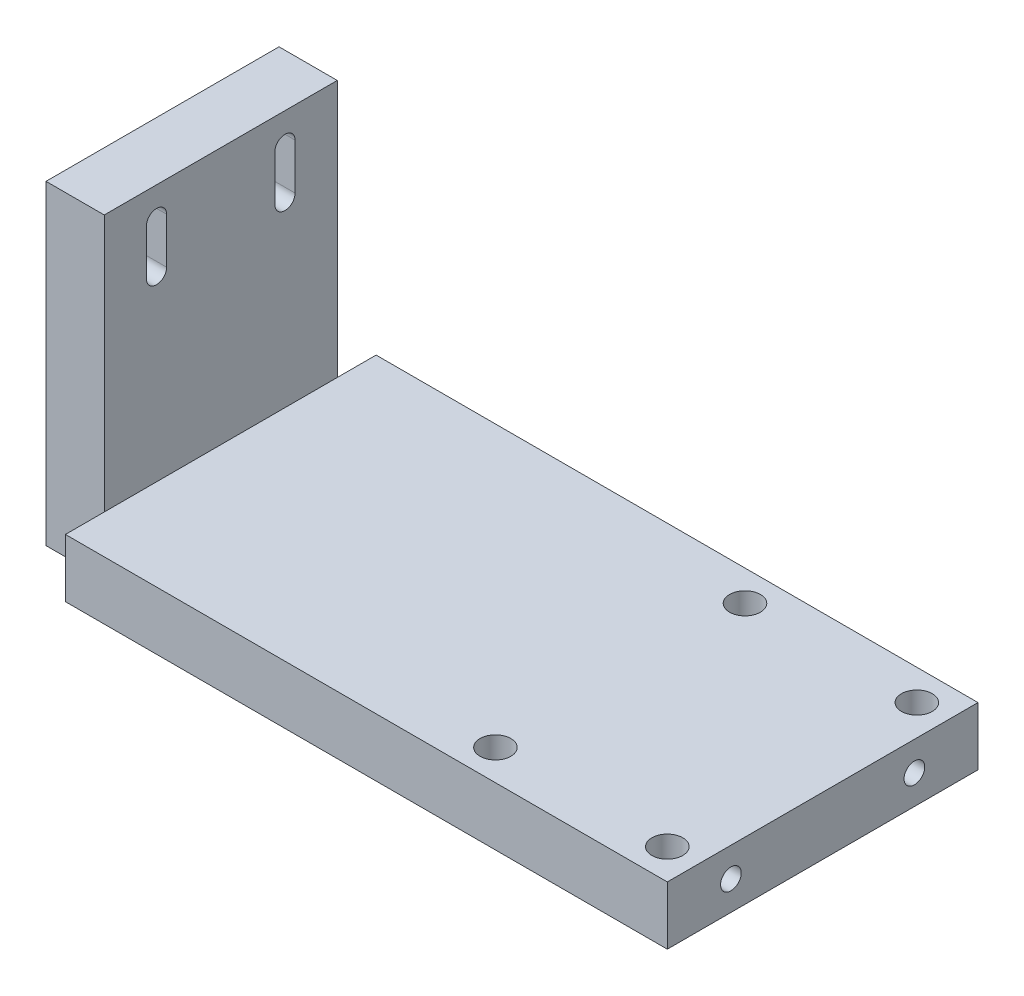
ISO-10303-21;
HEADER;
FILE_DESCRIPTION(('STEP AP214'),'2;1');
FILE_NAME('part.step','',(''),(''),'','','');
FILE_SCHEMA(('AUTOMOTIVE_DESIGN { 1 0 10303 214 1 1 1 1 }'));
ENDSEC;
DATA;
#1=APPLICATION_CONTEXT('core data for automotive mechanical design processes');
#2=APPLICATION_PROTOCOL_DEFINITION('international standard','automotive_design',2000,#1);
#3=PRODUCT_CONTEXT('',#1,'mechanical');
#4=PRODUCT('Part','Part','',(#3));
#5=PRODUCT_RELATED_PRODUCT_CATEGORY('part','',(#4));
#6=PRODUCT_DEFINITION_FORMATION('','',#4);
#7=PRODUCT_DEFINITION_CONTEXT('part definition',#1,'design');
#8=PRODUCT_DEFINITION('design','',#6,#7);
#9=PRODUCT_DEFINITION_SHAPE('','',#8);
#10=(LENGTH_UNIT() NAMED_UNIT(*) SI_UNIT(.MILLI.,.METRE.));
#11=(NAMED_UNIT(*) PLANE_ANGLE_UNIT() SI_UNIT($,.RADIAN.));
#12=(NAMED_UNIT(*) SI_UNIT($,.STERADIAN.) SOLID_ANGLE_UNIT());
#13=UNCERTAINTY_MEASURE_WITH_UNIT(LENGTH_MEASURE(1.E-05),#10,'distance_accuracy_value','');
#14=(GEOMETRIC_REPRESENTATION_CONTEXT(3) GLOBAL_UNCERTAINTY_ASSIGNED_CONTEXT((#13)) GLOBAL_UNIT_ASSIGNED_CONTEXT((#10,
#11,#12)) REPRESENTATION_CONTEXT('',''));
#15=CARTESIAN_POINT('',(0.,0.,0.));
#16=DIRECTION('',(0.,0.,1.));
#17=DIRECTION('',(1.,0.,0.));
#18=AXIS2_PLACEMENT_3D('',#15,#16,#17);
#19=CARTESIAN_POINT('',(9.52499999999982,0.,50.8));
#20=DIRECTION('',(-1.,0.,0.));
#21=DIRECTION('',(0.,0.,1.));
#22=AXIS2_PLACEMENT_3D('',#19,#20,#21);
#23=PLANE('',#22);
#24=CARTESIAN_POINT('',(9.5249999999999,0.,30.));
#25=DIRECTION('',(-1.,0.,0.));
#26=DIRECTION('',(0.,0.,1.));
#27=AXIS2_PLACEMENT_3D('',#24,#25,#26);
#28=CIRCLE('',#27,3.37819999999999);
#29=CARTESIAN_POINT('',(9.52499999999988,0.,33.3782));
#30=VERTEX_POINT('',#29);
#31=EDGE_CURVE('E67',#30,#30,#28,.T.);
#32=ORIENTED_EDGE('',*,*,#31,.T.);
#33=EDGE_LOOP('',(#32));
#34=FACE_BOUND('',#33,.T.);
#35=CARTESIAN_POINT('',(9.52500000000011,0.,-30.));
#36=DIRECTION('',(-1.,0.,0.));
#37=DIRECTION('',(0.,0.,1.));
#38=AXIS2_PLACEMENT_3D('',#35,#36,#37);
#39=CIRCLE('',#38,3.37819999999999);
#40=CARTESIAN_POINT('',(9.5250000000001,0.,-26.6218));
#41=VERTEX_POINT('',#40);
#42=EDGE_CURVE('E173',#41,#41,#39,.T.);
#43=ORIENTED_EDGE('',*,*,#42,.T.);
#44=EDGE_LOOP('',(#43));
#45=FACE_BOUND('',#44,.T.);
#46=DIRECTION('',(0.,-1.,0.));
#47=VECTOR('',#46,1.);
#48=CARTESIAN_POINT('',(9.52500000000006,83.65,-17.7));
#49=LINE('',#48,#47);
#50=CARTESIAN_POINT('',(9.52500000000007,83.65,-17.7));
#51=VERTEX_POINT('',#50);
#52=CARTESIAN_POINT('',(9.52500000000006,68.65,-17.7));
#53=VERTEX_POINT('',#52);
#54=EDGE_CURVE('E213',#51,#53,#49,.T.);
#55=ORIENTED_EDGE('',*,*,#54,.F.);
#56=CARTESIAN_POINT('',(9.52500000000008,83.65,-21.));
#57=DIRECTION('',(1.,0.,0.));
#58=DIRECTION('',(0.,0.,1.));
#59=AXIS2_PLACEMENT_3D('',#56,#57,#58);
#60=CIRCLE('',#59,3.3);
#61=CARTESIAN_POINT('',(9.52500000000009,83.65,-24.3));
#62=VERTEX_POINT('',#61);
#63=EDGE_CURVE('E195',#62,#51,#60,.T.);
#64=ORIENTED_EDGE('',*,*,#63,.F.);
#65=DIRECTION('',(0.,1.,0.));
#66=VECTOR('',#65,1.);
#67=CARTESIAN_POINT('',(9.52500000000009,83.65,-24.3));
#68=LINE('',#67,#66);
#69=CARTESIAN_POINT('',(9.52500000000009,68.65,-24.3));
#70=VERTEX_POINT('',#69);
#71=EDGE_CURVE('E202',#70,#62,#68,.T.);
#72=ORIENTED_EDGE('',*,*,#71,.F.);
#73=CARTESIAN_POINT('',(9.52500000000007,68.65,-21.));
#74=DIRECTION('',(1.,0.,0.));
#75=DIRECTION('',(0.,0.,1.));
#76=AXIS2_PLACEMENT_3D('',#73,#74,#75);
#77=CIRCLE('',#76,3.3);
#78=EDGE_CURVE('E216',#53,#70,#77,.T.);
#79=ORIENTED_EDGE('',*,*,#78,.F.);
#80=EDGE_LOOP('',(#55,#64,#72,#79));
#81=FACE_BOUND('',#80,.T.);
#82=DIRECTION('',(0.,-1.,0.));
#83=VECTOR('',#82,1.);
#84=CARTESIAN_POINT('',(9.52499999999992,83.65,24.3000000000001));
#85=LINE('',#84,#83);
#86=CARTESIAN_POINT('',(9.52499999999991,83.65,24.3000000000001));
#87=VERTEX_POINT('',#86);
#88=CARTESIAN_POINT('',(9.52499999999992,68.65,24.3000000000001));
#89=VERTEX_POINT('',#88);
#90=EDGE_CURVE('E245',#87,#89,#85,.T.);
#91=ORIENTED_EDGE('',*,*,#90,.F.);
#92=CARTESIAN_POINT('',(9.52499999999993,83.65,21.0000000000001));
#93=DIRECTION('',(1.,0.,0.));
#94=DIRECTION('',(0.,0.,-1.));
#95=AXIS2_PLACEMENT_3D('',#92,#93,#94);
#96=CIRCLE('',#95,3.3);
#97=CARTESIAN_POINT('',(9.52499999999994,83.65,17.7000000000001));
#98=VERTEX_POINT('',#97);
#99=EDGE_CURVE('E223',#98,#87,#96,.T.);
#100=ORIENTED_EDGE('',*,*,#99,.F.);
#101=DIRECTION('',(0.,1.,0.));
#102=VECTOR('',#101,1.);
#103=CARTESIAN_POINT('',(9.52499999999994,83.65,17.7000000000001));
#104=LINE('',#103,#102);
#105=CARTESIAN_POINT('',(9.52499999999994,68.65,17.7000000000001));
#106=VERTEX_POINT('',#105);
#107=EDGE_CURVE('E234',#106,#98,#104,.T.);
#108=ORIENTED_EDGE('',*,*,#107,.F.);
#109=CARTESIAN_POINT('',(9.52499999999993,68.65,21.0000000000001));
#110=DIRECTION('',(1.,0.,0.));
#111=DIRECTION('',(0.,0.,-1.));
#112=AXIS2_PLACEMENT_3D('',#109,#110,#111);
#113=CIRCLE('',#112,3.3);
#114=EDGE_CURVE('E248',#89,#106,#113,.T.);
#115=ORIENTED_EDGE('',*,*,#114,.F.);
#116=EDGE_LOOP('',(#91,#100,#108,#115));
#117=FACE_BOUND('',#116,.T.);
#118=DIRECTION('',(0.,0.,1.));
#119=VECTOR('',#118,1.);
#120=CARTESIAN_POINT('',(9.52499999999982,-9.52500000000018,50.8));
#121=LINE('',#120,#119);
#122=CARTESIAN_POINT('',(9.52500000000014,-9.52500000000018,-38.1));
#123=VERTEX_POINT('',#122);
#124=CARTESIAN_POINT('',(9.52499999999982,-9.52500000000045,38.1));
#125=VERTEX_POINT('',#124);
#126=EDGE_CURVE('E13',#123,#125,#121,.T.);
#127=ORIENTED_EDGE('',*,*,#126,.F.);
#128=DIRECTION('',(0.,1.,0.));
#129=VECTOR('',#128,1.);
#130=CARTESIAN_POINT('',(9.52499999999982,-9.52500000000045,-38.1));
#131=LINE('',#130,#129);
#132=CARTESIAN_POINT('',(9.52499999999981,93.65,-38.1));
#133=VERTEX_POINT('',#132);
#134=EDGE_CURVE('E80',#123,#133,#131,.T.);
#135=ORIENTED_EDGE('',*,*,#134,.T.);
#136=DIRECTION('',(0.,0.,1.));
#137=VECTOR('',#136,1.);
#138=CARTESIAN_POINT('',(9.52499999999982,93.65,50.8));
#139=LINE('',#138,#137);
#140=CARTESIAN_POINT('',(9.52499999999981,93.65,38.1));
#141=VERTEX_POINT('',#140);
#142=EDGE_CURVE('E170',#133,#141,#139,.T.);
#143=ORIENTED_EDGE('',*,*,#142,.T.);
#144=DIRECTION('',(0.,1.,0.));
#145=VECTOR('',#144,1.);
#146=CARTESIAN_POINT('',(9.52499999999982,-9.52500000000045,38.1));
#147=LINE('',#146,#145);
#148=EDGE_CURVE('E192',#125,#141,#147,.T.);
#149=ORIENTED_EDGE('',*,*,#148,.F.);
#150=EDGE_LOOP('',(#127,#135,#143,#149));
#151=FACE_BOUND('',#150,.T.);
#152=ADVANCED_FACE('F63',(#34,#45,#81,#117,#151),#23,.F.);
#153=CARTESIAN_POINT('',(-9.52500000000018,0.,50.7999999999999));
#154=DIRECTION('',(1.,0.,0.));
#155=DIRECTION('',(0.,0.,-1.));
#156=AXIS2_PLACEMENT_3D('',#153,#154,#155);
#157=PLANE('',#156);
#158=CARTESIAN_POINT('',(-9.52500000000011,0.,30.));
#159=DIRECTION('',(-1.,0.,0.));
#160=DIRECTION('',(0.,0.,1.));
#161=AXIS2_PLACEMENT_3D('',#158,#159,#160);
#162=CIRCLE('',#161,5.55625);
#163=CARTESIAN_POINT('',(-9.52500000000013,0.,35.55625));
#164=VERTEX_POINT('',#163);
#165=EDGE_CURVE('E478',#164,#164,#162,.T.);
#166=ORIENTED_EDGE('',*,*,#165,.F.);
#167=EDGE_LOOP('',(#166));
#168=FACE_BOUND('',#167,.T.);
#169=CARTESIAN_POINT('',(-9.52499999999989,0.,-30.));
#170=DIRECTION('',(-1.,0.,0.));
#171=DIRECTION('',(0.,0.,1.));
#172=AXIS2_PLACEMENT_3D('',#169,#170,#171);
#173=CIRCLE('',#172,5.55625);
#174=CARTESIAN_POINT('',(-9.52499999999991,0.,-24.44375));
#175=VERTEX_POINT('',#174);
#176=EDGE_CURVE('E185',#175,#175,#173,.T.);
#177=ORIENTED_EDGE('',*,*,#176,.F.);
#178=EDGE_LOOP('',(#177));
#179=FACE_BOUND('',#178,.T.);
#180=DIRECTION('',(0.,1.,0.));
#181=VECTOR('',#180,1.);
#182=CARTESIAN_POINT('',(-9.52500000000027,83.65,-24.3000000000001));
#183=LINE('',#182,#181);
#184=CARTESIAN_POINT('',(-9.52500000000027,68.65,-24.3000000000001));
#185=VERTEX_POINT('',#184);
#186=CARTESIAN_POINT('',(-9.52500000000027,83.65,-24.3000000000001));
#187=VERTEX_POINT('',#186);
#188=EDGE_CURVE('E208',#185,#187,#183,.T.);
#189=ORIENTED_EDGE('',*,*,#188,.T.);
#190=CARTESIAN_POINT('',(-9.52500000000028,83.65,-21.0000000000001));
#191=DIRECTION('',(1.,0.,0.));
#192=DIRECTION('',(0.,0.,1.));
#193=AXIS2_PLACEMENT_3D('',#190,#191,#192);
#194=CIRCLE('',#193,3.3);
#195=CARTESIAN_POINT('',(-9.5250000000003,83.65,-17.7000000000001));
#196=VERTEX_POINT('',#195);
#197=EDGE_CURVE('E198',#187,#196,#194,.T.);
#198=ORIENTED_EDGE('',*,*,#197,.T.);
#199=DIRECTION('',(0.,-1.,0.));
#200=VECTOR('',#199,1.);
#201=CARTESIAN_POINT('',(-9.5250000000003,83.65,-17.7000000000001));
#202=LINE('',#201,#200);
#203=CARTESIAN_POINT('',(-9.52499999999994,68.65,-17.7000000000001));
#204=VERTEX_POINT('',#203);
#205=EDGE_CURVE('E201',#196,#204,#202,.T.);
#206=ORIENTED_EDGE('',*,*,#205,.T.);
#207=CARTESIAN_POINT('',(-9.52500000000029,68.65,-21.0000000000001));
#208=DIRECTION('',(1.,0.,0.));
#209=DIRECTION('',(0.,0.,1.));
#210=AXIS2_PLACEMENT_3D('',#207,#208,#209);
#211=CIRCLE('',#210,3.3);
#212=EDGE_CURVE('E205',#204,#185,#211,.T.);
#213=ORIENTED_EDGE('',*,*,#212,.T.);
#214=EDGE_LOOP('',(#189,#198,#206,#213));
#215=FACE_BOUND('',#214,.T.);
#216=DIRECTION('',(0.,1.,0.));
#217=VECTOR('',#216,1.);
#218=CARTESIAN_POINT('',(-9.52500000000042,83.65,17.7));
#219=LINE('',#218,#217);
#220=CARTESIAN_POINT('',(-9.52500000000042,68.65,17.7));
#221=VERTEX_POINT('',#220);
#222=CARTESIAN_POINT('',(-9.52500000000042,83.65,17.7));
#223=VERTEX_POINT('',#222);
#224=EDGE_CURVE('E240',#221,#223,#219,.T.);
#225=ORIENTED_EDGE('',*,*,#224,.T.);
#226=CARTESIAN_POINT('',(-9.52500000000043,83.65,21.));
#227=DIRECTION('',(1.,0.,0.));
#228=DIRECTION('',(0.,0.,-1.));
#229=AXIS2_PLACEMENT_3D('',#226,#227,#228);
#230=CIRCLE('',#229,3.3);
#231=CARTESIAN_POINT('',(-9.52500000000044,83.65,24.3));
#232=VERTEX_POINT('',#231);
#233=EDGE_CURVE('E230',#223,#232,#230,.T.);
#234=ORIENTED_EDGE('',*,*,#233,.T.);
#235=DIRECTION('',(0.,-1.,0.));
#236=VECTOR('',#235,1.);
#237=CARTESIAN_POINT('',(-9.52500000000044,83.65,24.3));
#238=LINE('',#237,#236);
#239=CARTESIAN_POINT('',(-9.52500000000009,68.65,24.3));
#240=VERTEX_POINT('',#239);
#241=EDGE_CURVE('E233',#232,#240,#238,.T.);
#242=ORIENTED_EDGE('',*,*,#241,.T.);
#243=CARTESIAN_POINT('',(-9.52500000000043,68.65,21.));
#244=DIRECTION('',(1.,0.,0.));
#245=DIRECTION('',(0.,0.,-1.));
#246=AXIS2_PLACEMENT_3D('',#243,#244,#245);
#247=CIRCLE('',#246,3.3);
#248=EDGE_CURVE('E237',#240,#221,#247,.T.);
#249=ORIENTED_EDGE('',*,*,#248,.T.);
#250=EDGE_LOOP('',(#225,#234,#242,#249));
#251=FACE_BOUND('',#250,.T.);
#252=DIRECTION('',(0.,0.,-1.));
#253=VECTOR('',#252,1.);
#254=CARTESIAN_POINT('',(-9.52500000000018,93.65,50.7999999999999));
#255=LINE('',#254,#253);
#256=CARTESIAN_POINT('',(-9.52500000000018,93.65,38.1));
#257=VERTEX_POINT('',#256);
#258=CARTESIAN_POINT('',(-9.52500000000018,93.65,-38.1));
#259=VERTEX_POINT('',#258);
#260=EDGE_CURVE('E166',#257,#259,#255,.T.);
#261=ORIENTED_EDGE('',*,*,#260,.T.);
#262=DIRECTION('',(0.,1.,0.));
#263=VECTOR('',#262,1.);
#264=CARTESIAN_POINT('',(-9.52500000000018,-9.52500000000045,-38.1));
#265=LINE('',#264,#263);
#266=CARTESIAN_POINT('',(-9.52500000000018,-9.52500000000045,-38.1));
#267=VERTEX_POINT('',#266);
#268=EDGE_CURVE('E154',#267,#259,#265,.T.);
#269=ORIENTED_EDGE('',*,*,#268,.F.);
#270=DIRECTION('',(0.,0.,-1.));
#271=VECTOR('',#270,1.);
#272=CARTESIAN_POINT('',(-9.52500000000018,-9.52500000000018,50.7999999999999));
#273=LINE('',#272,#271);
#274=CARTESIAN_POINT('',(-9.52500000000014,-9.52500000000018,38.1));
#275=VERTEX_POINT('',#274);
#276=EDGE_CURVE('E72',#275,#267,#273,.T.);
#277=ORIENTED_EDGE('',*,*,#276,.F.);
#278=DIRECTION('',(0.,1.,0.));
#279=VECTOR('',#278,1.);
#280=CARTESIAN_POINT('',(-9.52500000000018,-9.52500000000045,38.1));
#281=LINE('',#280,#279);
#282=EDGE_CURVE('E88',#275,#257,#281,.T.);
#283=ORIENTED_EDGE('',*,*,#282,.T.);
#284=EDGE_LOOP('',(#261,#269,#277,#283));
#285=FACE_BOUND('',#284,.T.);
#286=ADVANCED_FACE('F164',(#168,#179,#215,#251,#285),#157,.F.);
#287=CARTESIAN_POINT('',(0.,93.65,0.));
#288=DIRECTION('',(0.,1.,0.));
#289=DIRECTION('',(0.,0.,1.));
#290=AXIS2_PLACEMENT_3D('',#287,#288,#289);
#291=PLANE('',#290);
#292=DIRECTION('',(1.,0.,0.));
#293=VECTOR('',#292,1.);
#294=CARTESIAN_POINT('',(-9.52500000000018,93.65,-38.1));
#295=LINE('',#294,#293);
#296=EDGE_CURVE('E159',#259,#133,#295,.T.);
#297=ORIENTED_EDGE('',*,*,#296,.F.);
#298=ORIENTED_EDGE('',*,*,#260,.F.);
#299=DIRECTION('',(-1.,0.,0.));
#300=VECTOR('',#299,1.);
#301=CARTESIAN_POINT('',(-9.52500000000018,93.65,38.1));
#302=LINE('',#301,#300);
#303=EDGE_CURVE('E189',#141,#257,#302,.T.);
#304=ORIENTED_EDGE('',*,*,#303,.F.);
#305=ORIENTED_EDGE('',*,*,#142,.F.);
#306=EDGE_LOOP('',(#297,#298,#304,#305));
#307=FACE_BOUND('',#306,.T.);
#308=ADVANCED_FACE('F266',(#307),#291,.T.);
#309=CARTESIAN_POINT('',(0.,-9.52500000000018,50.8));
#310=DIRECTION('',(0.,-1.,0.));
#311=DIRECTION('',(0.,0.,-1.));
#312=AXIS2_PLACEMENT_3D('',#309,#310,#311);
#313=PLANE('',#312);
#314=DIRECTION('',(1.,0.,0.));
#315=VECTOR('',#314,1.);
#316=CARTESIAN_POINT('',(-9.52500000000018,-9.52500000000045,-38.1));
#317=LINE('',#316,#315);
#318=EDGE_CURVE('E151',#267,#123,#317,.T.);
#319=ORIENTED_EDGE('',*,*,#318,.T.);
#320=ORIENTED_EDGE('',*,*,#126,.T.);
#321=DIRECTION('',(-1.,0.,0.));
#322=VECTOR('',#321,1.);
#323=CARTESIAN_POINT('',(-9.52500000000018,-9.52500000000045,38.1));
#324=LINE('',#323,#322);
#325=EDGE_CURVE('E168',#125,#275,#324,.T.);
#326=ORIENTED_EDGE('',*,*,#325,.T.);
#327=ORIENTED_EDGE('',*,*,#276,.T.);
#328=EDGE_LOOP('',(#319,#320,#326,#327));
#329=FACE_BOUND('',#328,.T.);
#330=ADVANCED_FACE('F65',(#329),#313,.T.);
#331=CARTESIAN_POINT('',(-9.52500000000043,83.65,21.));
#332=DIRECTION('',(1.,0.,0.));
#333=DIRECTION('',(0.,0.,-1.));
#334=AXIS2_PLACEMENT_3D('',#331,#332,#333);
#335=CYLINDRICAL_SURFACE('',#334,3.3);
#336=ORIENTED_EDGE('',*,*,#99,.T.);
#337=DIRECTION('',(1.,0.,0.));
#338=VECTOR('',#337,1.);
#339=CARTESIAN_POINT('',(-9.52500000000044,83.65,24.3));
#340=LINE('',#339,#338);
#341=EDGE_CURVE('E243',#232,#87,#340,.T.);
#342=ORIENTED_EDGE('',*,*,#341,.F.);
#343=ORIENTED_EDGE('',*,*,#233,.F.);
#344=DIRECTION('',(1.,0.,0.));
#345=VECTOR('',#344,1.);
#346=CARTESIAN_POINT('',(-9.52500000000042,83.65,17.7));
#347=LINE('',#346,#345);
#348=EDGE_CURVE('E253',#223,#98,#347,.T.);
#349=ORIENTED_EDGE('',*,*,#348,.T.);
#350=EDGE_LOOP('',(#336,#342,#343,#349));
#351=FACE_BOUND('',#350,.T.);
#352=ADVANCED_FACE('F273',(#351),#335,.F.);
#353=CARTESIAN_POINT('',(-9.52500000000042,83.65,17.7));
#354=DIRECTION('',(0.,0.,-1.));
#355=DIRECTION('',(-1.,0.,0.));
#356=AXIS2_PLACEMENT_3D('',#353,#354,#355);
#357=PLANE('',#356);
#358=ORIENTED_EDGE('',*,*,#107,.T.);
#359=ORIENTED_EDGE('',*,*,#348,.F.);
#360=ORIENTED_EDGE('',*,*,#224,.F.);
#361=DIRECTION('',(1.,0.,0.));
#362=VECTOR('',#361,1.);
#363=CARTESIAN_POINT('',(-9.52500000000042,68.65,17.7));
#364=LINE('',#363,#362);
#365=EDGE_CURVE('E255',#221,#106,#364,.T.);
#366=ORIENTED_EDGE('',*,*,#365,.T.);
#367=EDGE_LOOP('',(#358,#359,#360,#366));
#368=FACE_BOUND('',#367,.T.);
#369=ADVANCED_FACE('F300',(#368),#357,.F.);
#370=CARTESIAN_POINT('',(-9.52500000000043,68.65,21.));
#371=DIRECTION('',(1.,0.,0.));
#372=DIRECTION('',(0.,0.,-1.));
#373=AXIS2_PLACEMENT_3D('',#370,#371,#372);
#374=CYLINDRICAL_SURFACE('',#373,3.3);
#375=ORIENTED_EDGE('',*,*,#114,.T.);
#376=ORIENTED_EDGE('',*,*,#365,.F.);
#377=ORIENTED_EDGE('',*,*,#248,.F.);
#378=DIRECTION('',(1.,0.,0.));
#379=VECTOR('',#378,1.);
#380=CARTESIAN_POINT('',(-9.52500000000044,68.65,24.3));
#381=LINE('',#380,#379);
#382=EDGE_CURVE('E257',#240,#89,#381,.T.);
#383=ORIENTED_EDGE('',*,*,#382,.T.);
#384=EDGE_LOOP('',(#375,#376,#377,#383));
#385=FACE_BOUND('',#384,.T.);
#386=ADVANCED_FACE('F302',(#385),#374,.F.);
#387=CARTESIAN_POINT('',(-9.52500000000044,83.65,24.3));
#388=DIRECTION('',(0.,0.,1.));
#389=DIRECTION('',(1.,0.,0.));
#390=AXIS2_PLACEMENT_3D('',#387,#388,#389);
#391=PLANE('',#390);
#392=ORIENTED_EDGE('',*,*,#90,.T.);
#393=ORIENTED_EDGE('',*,*,#382,.F.);
#394=ORIENTED_EDGE('',*,*,#241,.F.);
#395=ORIENTED_EDGE('',*,*,#341,.T.);
#396=EDGE_LOOP('',(#392,#393,#394,#395));
#397=FACE_BOUND('',#396,.T.);
#398=ADVANCED_FACE('F294',(#397),#391,.F.);
#399=CARTESIAN_POINT('',(-9.52500000000028,83.65,-21.0000000000001));
#400=DIRECTION('',(1.,0.,0.));
#401=DIRECTION('',(0.,0.,-1.));
#402=AXIS2_PLACEMENT_3D('',#399,#400,#401);
#403=CYLINDRICAL_SURFACE('',#402,3.3);
#404=ORIENTED_EDGE('',*,*,#63,.T.);
#405=DIRECTION('',(1.,0.,0.));
#406=VECTOR('',#405,1.);
#407=CARTESIAN_POINT('',(-9.5250000000003,83.65,-17.7000000000001));
#408=LINE('',#407,#406);
#409=EDGE_CURVE('E211',#196,#51,#408,.T.);
#410=ORIENTED_EDGE('',*,*,#409,.F.);
#411=ORIENTED_EDGE('',*,*,#197,.F.);
#412=DIRECTION('',(1.,0.,0.));
#413=VECTOR('',#412,1.);
#414=CARTESIAN_POINT('',(-9.52500000000027,83.65,-24.3000000000001));
#415=LINE('',#414,#413);
#416=EDGE_CURVE('E221',#187,#62,#415,.T.);
#417=ORIENTED_EDGE('',*,*,#416,.T.);
#418=EDGE_LOOP('',(#404,#410,#411,#417));
#419=FACE_BOUND('',#418,.T.);
#420=ADVANCED_FACE('F310',(#419),#403,.F.);
#421=CARTESIAN_POINT('',(-9.52500000000027,83.65,-24.3000000000001));
#422=DIRECTION('',(0.,0.,-1.));
#423=DIRECTION('',(-1.,0.,0.));
#424=AXIS2_PLACEMENT_3D('',#421,#422,#423);
#425=PLANE('',#424);
#426=ORIENTED_EDGE('',*,*,#71,.T.);
#427=ORIENTED_EDGE('',*,*,#416,.F.);
#428=ORIENTED_EDGE('',*,*,#188,.F.);
#429=DIRECTION('',(1.,0.,0.));
#430=VECTOR('',#429,1.);
#431=CARTESIAN_POINT('',(-9.52500000000027,68.65,-24.3000000000001));
#432=LINE('',#431,#430);
#433=EDGE_CURVE('E224',#185,#70,#432,.T.);
#434=ORIENTED_EDGE('',*,*,#433,.T.);
#435=EDGE_LOOP('',(#426,#427,#428,#434));
#436=FACE_BOUND('',#435,.T.);
#437=ADVANCED_FACE('F342',(#436),#425,.F.);
#438=CARTESIAN_POINT('',(-9.52500000000029,68.65,-21.0000000000001));
#439=DIRECTION('',(1.,0.,0.));
#440=DIRECTION('',(0.,0.,-1.));
#441=AXIS2_PLACEMENT_3D('',#438,#439,#440);
#442=CYLINDRICAL_SURFACE('',#441,3.3);
#443=ORIENTED_EDGE('',*,*,#78,.T.);
#444=ORIENTED_EDGE('',*,*,#433,.F.);
#445=ORIENTED_EDGE('',*,*,#212,.F.);
#446=DIRECTION('',(1.,0.,0.));
#447=VECTOR('',#446,1.);
#448=CARTESIAN_POINT('',(-9.5250000000003,68.65,-17.7000000000001));
#449=LINE('',#448,#447);
#450=EDGE_CURVE('E226',#204,#53,#449,.T.);
#451=ORIENTED_EDGE('',*,*,#450,.T.);
#452=EDGE_LOOP('',(#443,#444,#445,#451));
#453=FACE_BOUND('',#452,.T.);
#454=ADVANCED_FACE('F351',(#453),#442,.F.);
#455=CARTESIAN_POINT('',(-9.5250000000003,83.65,-17.7000000000001));
#456=DIRECTION('',(0.,0.,1.));
#457=DIRECTION('',(1.,0.,0.));
#458=AXIS2_PLACEMENT_3D('',#455,#456,#457);
#459=PLANE('',#458);
#460=ORIENTED_EDGE('',*,*,#54,.T.);
#461=ORIENTED_EDGE('',*,*,#450,.F.);
#462=ORIENTED_EDGE('',*,*,#205,.F.);
#463=ORIENTED_EDGE('',*,*,#409,.T.);
#464=EDGE_LOOP('',(#460,#461,#462,#463));
#465=FACE_BOUND('',#464,.T.);
#466=ADVANCED_FACE('F361',(#465),#459,.F.);
#467=CARTESIAN_POINT('',(-9.52500000000018,-9.52500000000045,38.1));
#468=DIRECTION('',(0.,0.,-1.));
#469=DIRECTION('',(-1.,0.,0.));
#470=AXIS2_PLACEMENT_3D('',#467,#468,#469);
#471=PLANE('',#470);
#472=ORIENTED_EDGE('',*,*,#303,.T.);
#473=ORIENTED_EDGE('',*,*,#282,.F.);
#474=ORIENTED_EDGE('',*,*,#325,.F.);
#475=ORIENTED_EDGE('',*,*,#148,.T.);
#476=EDGE_LOOP('',(#472,#473,#474,#475));
#477=FACE_BOUND('',#476,.T.);
#478=ADVANCED_FACE('F265',(#477),#471,.F.);
#479=CARTESIAN_POINT('',(-9.52500000000018,-9.52500000000045,-38.1));
#480=DIRECTION('',(0.,0.,1.));
#481=DIRECTION('',(1.,0.,0.));
#482=AXIS2_PLACEMENT_3D('',#479,#480,#481);
#483=PLANE('',#482);
#484=ORIENTED_EDGE('',*,*,#296,.T.);
#485=ORIENTED_EDGE('',*,*,#134,.F.);
#486=ORIENTED_EDGE('',*,*,#318,.F.);
#487=ORIENTED_EDGE('',*,*,#268,.T.);
#488=EDGE_LOOP('',(#484,#485,#486,#487));
#489=FACE_BOUND('',#488,.T.);
#490=ADVANCED_FACE('F153',(#489),#483,.F.);
#491=CARTESIAN_POINT('',(-9.52499999999989,0.,-30.));
#492=DIRECTION('',(-1.,0.,0.));
#493=DIRECTION('',(0.,0.,1.));
#494=AXIS2_PLACEMENT_3D('',#491,#492,#493);
#495=CYLINDRICAL_SURFACE('',#494,3.37819999999999);
#496=CARTESIAN_POINT('',(-3.17499999999989,0.,-30.));
#497=DIRECTION('',(-1.,0.,0.));
#498=DIRECTION('',(0.,0.,1.));
#499=AXIS2_PLACEMENT_3D('',#496,#497,#498);
#500=CIRCLE('',#499,3.37819999999999);
#501=CARTESIAN_POINT('',(-3.1749999999999,0.,-26.6218));
#502=VERTEX_POINT('',#501);
#503=EDGE_CURVE('E175',#502,#502,#500,.T.);
#504=ORIENTED_EDGE('',*,*,#503,.T.);
#505=EDGE_LOOP('',(#504));
#506=FACE_BOUND('',#505,.T.);
#507=ORIENTED_EDGE('',*,*,#42,.F.);
#508=EDGE_LOOP('',(#507));
#509=FACE_BOUND('',#508,.T.);
#510=ADVANCED_FACE('F398',(#506,#509),#495,.F.);
#511=CARTESIAN_POINT('',(-3.17499999999989,3.37819999999999,-30.));
#512=DIRECTION('',(1.,0.,0.));
#513=DIRECTION('',(0.,0.,-1.));
#514=AXIS2_PLACEMENT_3D('',#511,#512,#513);
#515=PLANE('',#514);
#516=ORIENTED_EDGE('',*,*,#503,.F.);
#517=EDGE_LOOP('',(#516));
#518=FACE_BOUND('',#517,.T.);
#519=CARTESIAN_POINT('',(-3.17499999999989,0.,-30.));
#520=DIRECTION('',(-1.,0.,0.));
#521=DIRECTION('',(0.,0.,1.));
#522=AXIS2_PLACEMENT_3D('',#519,#520,#521);
#523=CIRCLE('',#522,5.55625);
#524=CARTESIAN_POINT('',(-3.17499999999991,0.,-24.44375));
#525=VERTEX_POINT('',#524);
#526=EDGE_CURVE('E180',#525,#525,#523,.T.);
#527=ORIENTED_EDGE('',*,*,#526,.T.);
#528=EDGE_LOOP('',(#527));
#529=FACE_BOUND('',#528,.T.);
#530=ADVANCED_FACE('F419',(#518,#529),#515,.F.);
#531=CARTESIAN_POINT('',(-9.52499999999989,0.,-30.));
#532=DIRECTION('',(-1.,0.,0.));
#533=DIRECTION('',(0.,0.,1.));
#534=AXIS2_PLACEMENT_3D('',#531,#532,#533);
#535=CYLINDRICAL_SURFACE('',#534,5.55625);
#536=ORIENTED_EDGE('',*,*,#526,.F.);
#537=EDGE_LOOP('',(#536));
#538=FACE_BOUND('',#537,.T.);
#539=ORIENTED_EDGE('',*,*,#176,.T.);
#540=EDGE_LOOP('',(#539));
#541=FACE_BOUND('',#540,.T.);
#542=ADVANCED_FACE('F428',(#538,#541),#535,.F.);
#543=CARTESIAN_POINT('',(-9.52500000000011,0.,30.));
#544=DIRECTION('',(-1.,0.,0.));
#545=DIRECTION('',(0.,0.,1.));
#546=AXIS2_PLACEMENT_3D('',#543,#544,#545);
#547=CYLINDRICAL_SURFACE('',#546,3.37819999999999);
#548=CARTESIAN_POINT('',(-3.17500000000011,0.,30.));
#549=DIRECTION('',(-1.,0.,0.));
#550=DIRECTION('',(0.,0.,1.));
#551=AXIS2_PLACEMENT_3D('',#548,#549,#550);
#552=CIRCLE('',#551,3.37819999999999);
#553=CARTESIAN_POINT('',(-3.17500000000012,0.,33.3782));
#554=VERTEX_POINT('',#553);
#555=EDGE_CURVE('E480',#554,#554,#552,.T.);
#556=ORIENTED_EDGE('',*,*,#555,.T.);
#557=EDGE_LOOP('',(#556));
#558=FACE_BOUND('',#557,.T.);
#559=ORIENTED_EDGE('',*,*,#31,.F.);
#560=EDGE_LOOP('',(#559));
#561=FACE_BOUND('',#560,.T.);
#562=ADVANCED_FACE('F438',(#558,#561),#547,.F.);
#563=CARTESIAN_POINT('',(-3.17500000000011,3.37819999999999,30.));
#564=DIRECTION('',(1.,0.,0.));
#565=DIRECTION('',(0.,0.,-1.));
#566=AXIS2_PLACEMENT_3D('',#563,#564,#565);
#567=PLANE('',#566);
#568=ORIENTED_EDGE('',*,*,#555,.F.);
#569=EDGE_LOOP('',(#568));
#570=FACE_BOUND('',#569,.T.);
#571=CARTESIAN_POINT('',(-3.17500000000011,0.,30.));
#572=DIRECTION('',(-1.,0.,0.));
#573=DIRECTION('',(0.,0.,1.));
#574=AXIS2_PLACEMENT_3D('',#571,#572,#573);
#575=CIRCLE('',#574,5.55625);
#576=CARTESIAN_POINT('',(-3.17500000000013,0.,35.55625));
#577=VERTEX_POINT('',#576);
#578=EDGE_CURVE('E475',#577,#577,#575,.T.);
#579=ORIENTED_EDGE('',*,*,#578,.T.);
#580=EDGE_LOOP('',(#579));
#581=FACE_BOUND('',#580,.T.);
#582=ADVANCED_FACE('F448',(#570,#581),#567,.F.);
#583=CARTESIAN_POINT('',(-9.52500000000011,0.,30.));
#584=DIRECTION('',(-1.,0.,0.));
#585=DIRECTION('',(0.,0.,1.));
#586=AXIS2_PLACEMENT_3D('',#583,#584,#585);
#587=CYLINDRICAL_SURFACE('',#586,5.55625);
#588=ORIENTED_EDGE('',*,*,#578,.F.);
#589=EDGE_LOOP('',(#588));
#590=FACE_BOUND('',#589,.T.);
#591=ORIENTED_EDGE('',*,*,#165,.T.);
#592=EDGE_LOOP('',(#591));
#593=FACE_BOUND('',#592,.T.);
#594=ADVANCED_FACE('F458',(#590,#593),#587,.F.);
#595=CLOSED_SHELL('',(#152,#286,#308,#330,#352,#369,#386,#398,#420,#437,#454,#466,#478,#490,
#510,#530,#542,#562,#582,#594));
#596=MANIFOLD_SOLID_BREP('B2',#595);
#597=CARTESIAN_POINT('',(206.35,0.,0.));
#598=DIRECTION('',(-1.,0.,0.));
#599=DIRECTION('',(0.,0.,1.));
#600=AXIS2_PLACEMENT_3D('',#597,#598,#599);
#601=PLANE('',#600);
#602=CARTESIAN_POINT('',(206.35,0.,-29.9999999999996));
#603=DIRECTION('',(-1.,0.,0.));
#604=DIRECTION('',(0.,0.,1.));
#605=AXIS2_PLACEMENT_3D('',#602,#603,#604);
#606=CIRCLE('',#605,3.37819999999999);
#607=CARTESIAN_POINT('',(206.35,0.,-26.6217999999996));
#608=VERTEX_POINT('',#607);
#609=EDGE_CURVE('E589',#608,#608,#606,.T.);
#610=ORIENTED_EDGE('',*,*,#609,.T.);
#611=EDGE_LOOP('',(#610));
#612=FACE_BOUND('',#611,.T.);
#613=CARTESIAN_POINT('',(206.35,0.,30.0000000000004));
#614=DIRECTION('',(-1.,0.,0.));
#615=DIRECTION('',(0.,0.,1.));
#616=AXIS2_PLACEMENT_3D('',#613,#614,#615);
#617=CIRCLE('',#616,3.37819999999999);
#618=CARTESIAN_POINT('',(206.35,0.,33.3782000000004));
#619=VERTEX_POINT('',#618);
#620=EDGE_CURVE('E588',#619,#619,#617,.T.);
#621=ORIENTED_EDGE('',*,*,#620,.T.);
#622=EDGE_LOOP('',(#621));
#623=FACE_BOUND('',#622,.T.);
#624=DIRECTION('',(0.,1.,0.));
#625=VECTOR('',#624,1.);
#626=CARTESIAN_POINT('',(206.35,-9.52499999999982,-50.8));
#627=LINE('',#626,#625);
#628=CARTESIAN_POINT('',(206.35,-9.52499999999982,-50.8));
#629=VERTEX_POINT('',#628);
#630=CARTESIAN_POINT('',(206.35,9.52500000000019,-50.8));
#631=VERTEX_POINT('',#630);
#632=EDGE_CURVE('E635',#629,#631,#627,.T.);
#633=ORIENTED_EDGE('',*,*,#632,.T.);
#634=DIRECTION('',(0.,0.,1.));
#635=VECTOR('',#634,1.);
#636=CARTESIAN_POINT('',(206.35,9.52499999999982,50.8));
#637=LINE('',#636,#635);
#638=CARTESIAN_POINT('',(206.35,9.52499999999982,50.8));
#639=VERTEX_POINT('',#638);
#640=EDGE_CURVE('E637',#631,#639,#637,.T.);
#641=ORIENTED_EDGE('',*,*,#640,.T.);
#642=DIRECTION('',(0.,-1.,0.));
#643=VECTOR('',#642,1.);
#644=CARTESIAN_POINT('',(206.35,-9.52500000000018,50.7999999999999));
#645=LINE('',#644,#643);
#646=CARTESIAN_POINT('',(206.35,-9.52500000000018,50.7999999999999));
#647=VERTEX_POINT('',#646);
#648=EDGE_CURVE('E639',#639,#647,#645,.T.);
#649=ORIENTED_EDGE('',*,*,#648,.T.);
#650=DIRECTION('',(0.,0.,-1.));
#651=VECTOR('',#650,1.);
#652=CARTESIAN_POINT('',(206.35,-9.52500000000018,50.7999999999999));
#653=LINE('',#652,#651);
#654=EDGE_CURVE('E549',#647,#629,#653,.T.);
#655=ORIENTED_EDGE('',*,*,#654,.T.);
#656=EDGE_LOOP('',(#633,#641,#649,#655));
#657=FACE_BOUND('',#656,.T.);
#658=ADVANCED_FACE('F525',(#612,#623,#657),#601,.F.);
#659=CARTESIAN_POINT('',(206.35,-9.52500000000018,50.7999999999999));
#660=DIRECTION('',(0.,1.,0.));
#661=DIRECTION('',(0.,0.,1.));
#662=AXIS2_PLACEMENT_3D('',#659,#660,#661);
#663=PLANE('',#662);
#664=CARTESIAN_POINT('',(196.35,-9.52500000000041,40.8));
#665=DIRECTION('',(0.,1.,0.));
#666=DIRECTION('',(0.,0.,1.));
#667=AXIS2_PLACEMENT_3D('',#664,#665,#666);
#668=CIRCLE('',#667,5.04189999999999);
#669=CARTESIAN_POINT('',(196.35,-9.52500000000043,45.8418999999999));
#670=VERTEX_POINT('',#669);
#671=EDGE_CURVE('E609',#670,#670,#668,.T.);
#672=ORIENTED_EDGE('',*,*,#671,.T.);
#673=EDGE_LOOP('',(#672));
#674=FACE_BOUND('',#673,.T.);
#675=CARTESIAN_POINT('',(140.15,-9.52500000000041,40.8));
#676=DIRECTION('',(0.,1.,0.));
#677=DIRECTION('',(0.,0.,1.));
#678=AXIS2_PLACEMENT_3D('',#675,#676,#677);
#679=CIRCLE('',#678,5.04189999999999);
#680=CARTESIAN_POINT('',(140.15,-9.52500000000043,45.8418999999999));
#681=VERTEX_POINT('',#680);
#682=EDGE_CURVE('E615',#681,#681,#679,.T.);
#683=ORIENTED_EDGE('',*,*,#682,.T.);
#684=EDGE_LOOP('',(#683));
#685=FACE_BOUND('',#684,.T.);
#686=CARTESIAN_POINT('',(196.35,-9.52500000000013,-40.8));
#687=DIRECTION('',(0.,1.,0.));
#688=DIRECTION('',(0.,0.,1.));
#689=AXIS2_PLACEMENT_3D('',#686,#687,#688);
#690=CIRCLE('',#689,5.04189999999999);
#691=CARTESIAN_POINT('',(196.35,-9.52500000000015,-35.7581));
#692=VERTEX_POINT('',#691);
#693=EDGE_CURVE('E621',#692,#692,#690,.T.);
#694=ORIENTED_EDGE('',*,*,#693,.T.);
#695=EDGE_LOOP('',(#694));
#696=FACE_BOUND('',#695,.T.);
#697=CARTESIAN_POINT('',(140.15,-9.52500000000013,-40.8));
#698=DIRECTION('',(0.,1.,0.));
#699=DIRECTION('',(0.,0.,1.));
#700=AXIS2_PLACEMENT_3D('',#697,#698,#699);
#701=CIRCLE('',#700,5.04189999999999);
#702=CARTESIAN_POINT('',(140.15,-9.52500000000015,-35.7581));
#703=VERTEX_POINT('',#702);
#704=EDGE_CURVE('E627',#703,#703,#701,.T.);
#705=ORIENTED_EDGE('',*,*,#704,.T.);
#706=EDGE_LOOP('',(#705));
#707=FACE_BOUND('',#706,.T.);
#708=DIRECTION('',(0.,0.,1.));
#709=VECTOR('',#708,1.);
#710=CARTESIAN_POINT('',(9.52499999999981,-9.52500000000018,50.7999999999992));
#711=LINE('',#710,#709);
#712=CARTESIAN_POINT('',(9.52500000000006,-9.52499999999982,-50.8));
#713=VERTEX_POINT('',#712);
#714=CARTESIAN_POINT('',(9.52499999999982,-9.52500000000018,50.8));
#715=VERTEX_POINT('',#714);
#716=EDGE_CURVE('E61',#713,#715,#711,.T.);
#717=ORIENTED_EDGE('',*,*,#716,.F.);
#718=DIRECTION('',(-1.,0.,0.));
#719=VECTOR('',#718,1.);
#720=CARTESIAN_POINT('',(206.35,-9.52499999999982,-50.8));
#721=LINE('',#720,#719);
#722=EDGE_CURVE('E642',#629,#713,#721,.T.);
#723=ORIENTED_EDGE('',*,*,#722,.F.);
#724=ORIENTED_EDGE('',*,*,#654,.F.);
#725=DIRECTION('',(-1.,0.,0.));
#726=VECTOR('',#725,1.);
#727=CARTESIAN_POINT('',(206.35,-9.52500000000018,50.7999999999999));
#728=LINE('',#727,#726);
#729=EDGE_CURVE('E645',#647,#715,#728,.T.);
#730=ORIENTED_EDGE('',*,*,#729,.T.);
#731=EDGE_LOOP('',(#717,#723,#724,#730));
#732=FACE_BOUND('',#731,.T.);
#733=ADVANCED_FACE('F673',(#674,#685,#696,#707,#732),#663,.F.);
#734=CARTESIAN_POINT('',(206.35,-9.52500000000018,50.7999999999999));
#735=DIRECTION('',(0.,0.,-1.));
#736=DIRECTION('',(0.,1.,0.));
#737=AXIS2_PLACEMENT_3D('',#734,#735,#736);
#738=PLANE('',#737);
#739=DIRECTION('',(0.,1.,0.));
#740=VECTOR('',#739,1.);
#741=CARTESIAN_POINT('',(9.52499999999982,0.,50.8));
#742=LINE('',#741,#740);
#743=CARTESIAN_POINT('',(9.52499999999982,9.52499999999982,50.8));
#744=VERTEX_POINT('',#743);
#745=EDGE_CURVE('E630',#715,#744,#742,.T.);
#746=ORIENTED_EDGE('',*,*,#745,.F.);
#747=ORIENTED_EDGE('',*,*,#729,.F.);
#748=ORIENTED_EDGE('',*,*,#648,.F.);
#749=DIRECTION('',(-1.,0.,0.));
#750=VECTOR('',#749,1.);
#751=CARTESIAN_POINT('',(206.35,9.52499999999982,50.8));
#752=LINE('',#751,#750);
#753=EDGE_CURVE('E648',#639,#744,#752,.T.);
#754=ORIENTED_EDGE('',*,*,#753,.T.);
#755=EDGE_LOOP('',(#746,#747,#748,#754));
#756=FACE_BOUND('',#755,.T.);
#757=ADVANCED_FACE('F679',(#756),#738,.F.);
#758=CARTESIAN_POINT('',(206.35,9.52499999999982,50.8));
#759=DIRECTION('',(0.,-1.,0.));
#760=DIRECTION('',(0.,0.,-1.));
#761=AXIS2_PLACEMENT_3D('',#758,#759,#760);
#762=PLANE('',#761);
#763=CARTESIAN_POINT('',(196.35,9.52499999999986,40.8));
#764=DIRECTION('',(0.,1.,0.));
#765=DIRECTION('',(0.,0.,1.));
#766=AXIS2_PLACEMENT_3D('',#763,#764,#765);
#767=CIRCLE('',#766,5.04189999999999);
#768=CARTESIAN_POINT('',(196.35,9.52499999999984,45.8419));
#769=VERTEX_POINT('',#768);
#770=EDGE_CURVE('E606',#769,#769,#767,.T.);
#771=ORIENTED_EDGE('',*,*,#770,.F.);
#772=EDGE_LOOP('',(#771));
#773=FACE_BOUND('',#772,.T.);
#774=CARTESIAN_POINT('',(140.15,9.52499999999986,40.8));
#775=DIRECTION('',(0.,1.,0.));
#776=DIRECTION('',(0.,0.,1.));
#777=AXIS2_PLACEMENT_3D('',#774,#775,#776);
#778=CIRCLE('',#777,5.04189999999999);
#779=CARTESIAN_POINT('',(140.15,9.52499999999984,45.8419));
#780=VERTEX_POINT('',#779);
#781=EDGE_CURVE('E612',#780,#780,#778,.T.);
#782=ORIENTED_EDGE('',*,*,#781,.F.);
#783=EDGE_LOOP('',(#782));
#784=FACE_BOUND('',#783,.T.);
#785=CARTESIAN_POINT('',(196.35,9.52500000000015,-40.8));
#786=DIRECTION('',(0.,1.,0.));
#787=DIRECTION('',(0.,0.,1.));
#788=AXIS2_PLACEMENT_3D('',#785,#786,#787);
#789=CIRCLE('',#788,5.04189999999999);
#790=CARTESIAN_POINT('',(196.35,9.52500000000013,-35.7581));
#791=VERTEX_POINT('',#790);
#792=EDGE_CURVE('E618',#791,#791,#789,.T.);
#793=ORIENTED_EDGE('',*,*,#792,.F.);
#794=EDGE_LOOP('',(#793));
#795=FACE_BOUND('',#794,.T.);
#796=CARTESIAN_POINT('',(140.15,9.52500000000015,-40.8));
#797=DIRECTION('',(0.,1.,0.));
#798=DIRECTION('',(0.,0.,1.));
#799=AXIS2_PLACEMENT_3D('',#796,#797,#798);
#800=CIRCLE('',#799,5.04189999999999);
#801=CARTESIAN_POINT('',(140.15,9.52500000000013,-35.7581));
#802=VERTEX_POINT('',#801);
#803=EDGE_CURVE('E624',#802,#802,#800,.T.);
#804=ORIENTED_EDGE('',*,*,#803,.F.);
#805=EDGE_LOOP('',(#804));
#806=FACE_BOUND('',#805,.T.);
#807=DIRECTION('',(0.,0.,-1.));
#808=VECTOR('',#807,1.);
#809=CARTESIAN_POINT('',(9.52499999999981,9.52499999999982,50.7999999999993));
#810=LINE('',#809,#808);
#811=CARTESIAN_POINT('',(9.52500000000019,9.525,-50.8));
#812=VERTEX_POINT('',#811);
#813=EDGE_CURVE('E633',#744,#812,#810,.T.);
#814=ORIENTED_EDGE('',*,*,#813,.F.);
#815=ORIENTED_EDGE('',*,*,#753,.F.);
#816=ORIENTED_EDGE('',*,*,#640,.F.);
#817=DIRECTION('',(-1.,0.,0.));
#818=VECTOR('',#817,1.);
#819=CARTESIAN_POINT('',(206.35,9.52500000000019,-50.8));
#820=LINE('',#819,#818);
#821=EDGE_CURVE('E534',#631,#812,#820,.T.);
#822=ORIENTED_EDGE('',*,*,#821,.T.);
#823=EDGE_LOOP('',(#814,#815,#816,#822));
#824=FACE_BOUND('',#823,.T.);
#825=ADVANCED_FACE('F670',(#773,#784,#795,#806,#824),#762,.F.);
#826=CARTESIAN_POINT('',(206.35,-9.52499999999982,-50.8));
#827=DIRECTION('',(0.,0.,1.));
#828=DIRECTION('',(0.,-1.,0.));
#829=AXIS2_PLACEMENT_3D('',#826,#827,#828);
#830=PLANE('',#829);
#831=DIRECTION('',(0.,1.,0.));
#832=VECTOR('',#831,1.);
#833=CARTESIAN_POINT('',(9.52500000000019,0.,-50.8));
#834=LINE('',#833,#832);
#835=EDGE_CURVE('E541',#713,#812,#834,.T.);
#836=ORIENTED_EDGE('',*,*,#835,.T.);
#837=ORIENTED_EDGE('',*,*,#821,.F.);
#838=ORIENTED_EDGE('',*,*,#632,.F.);
#839=ORIENTED_EDGE('',*,*,#722,.T.);
#840=EDGE_LOOP('',(#836,#837,#838,#839));
#841=FACE_BOUND('',#840,.T.);
#842=ADVANCED_FACE('F527',(#841),#830,.F.);
#843=CARTESIAN_POINT('',(9.52499999999982,0.,50.8));
#844=DIRECTION('',(-1.,0.,0.));
#845=DIRECTION('',(0.,0.,1.));
#846=AXIS2_PLACEMENT_3D('',#843,#844,#845);
#847=PLANE('',#846);
#848=CARTESIAN_POINT('',(9.5249999999999,0.,30.));
#849=DIRECTION('',(-1.,0.,0.));
#850=DIRECTION('',(0.,0.,1.));
#851=AXIS2_PLACEMENT_3D('',#848,#849,#850);
#852=CIRCLE('',#851,3.37819999999999);
#853=CARTESIAN_POINT('',(9.52499999999988,0.,33.3782));
#854=VERTEX_POINT('',#853);
#855=EDGE_CURVE('E529',#854,#854,#852,.T.);
#856=ORIENTED_EDGE('',*,*,#855,.F.);
#857=EDGE_LOOP('',(#856));
#858=FACE_BOUND('',#857,.T.);
#859=CARTESIAN_POINT('',(9.52500000000011,0.,-30.));
#860=DIRECTION('',(-1.,0.,0.));
#861=DIRECTION('',(0.,0.,1.));
#862=AXIS2_PLACEMENT_3D('',#859,#860,#861);
#863=CIRCLE('',#862,3.37819999999999);
#864=CARTESIAN_POINT('',(9.5250000000001,0.,-26.6218));
#865=VERTEX_POINT('',#864);
#866=EDGE_CURVE('E605',#865,#865,#863,.T.);
#867=ORIENTED_EDGE('',*,*,#866,.F.);
#868=EDGE_LOOP('',(#867));
#869=FACE_BOUND('',#868,.T.);
#870=ORIENTED_EDGE('',*,*,#813,.T.);
#871=ORIENTED_EDGE('',*,*,#835,.F.);
#872=ORIENTED_EDGE('',*,*,#716,.T.);
#873=ORIENTED_EDGE('',*,*,#745,.T.);
#874=EDGE_LOOP('',(#870,#871,#872,#873));
#875=FACE_BOUND('',#874,.T.);
#876=ADVANCED_FACE('F658',(#858,#869,#875),#847,.T.);
#877=CARTESIAN_POINT('',(140.15,9.52500000000014,-40.8));
#878=DIRECTION('',(0.,1.,0.));
#879=DIRECTION('',(0.,0.,1.));
#880=AXIS2_PLACEMENT_3D('',#877,#878,#879);
#881=CYLINDRICAL_SURFACE('',#880,5.04189999999999);
#882=ORIENTED_EDGE('',*,*,#704,.F.);
#883=EDGE_LOOP('',(#882));
#884=FACE_BOUND('',#883,.T.);
#885=ORIENTED_EDGE('',*,*,#803,.T.);
#886=EDGE_LOOP('',(#885));
#887=FACE_BOUND('',#886,.T.);
#888=ADVANCED_FACE('F660',(#884,#887),#881,.F.);
#889=CARTESIAN_POINT('',(196.35,9.52500000000014,-40.8));
#890=DIRECTION('',(0.,1.,0.));
#891=DIRECTION('',(0.,0.,1.));
#892=AXIS2_PLACEMENT_3D('',#889,#890,#891);
#893=CYLINDRICAL_SURFACE('',#892,5.04189999999999);
#894=ORIENTED_EDGE('',*,*,#693,.F.);
#895=EDGE_LOOP('',(#894));
#896=FACE_BOUND('',#895,.T.);
#897=ORIENTED_EDGE('',*,*,#792,.T.);
#898=EDGE_LOOP('',(#897));
#899=FACE_BOUND('',#898,.T.);
#900=ADVANCED_FACE('F701',(#896,#899),#893,.F.);
#901=CARTESIAN_POINT('',(140.15,9.52499999999986,40.8));
#902=DIRECTION('',(0.,1.,0.));
#903=DIRECTION('',(0.,0.,1.));
#904=AXIS2_PLACEMENT_3D('',#901,#902,#903);
#905=CYLINDRICAL_SURFACE('',#904,5.04189999999999);
#906=ORIENTED_EDGE('',*,*,#682,.F.);
#907=EDGE_LOOP('',(#906));
#908=FACE_BOUND('',#907,.T.);
#909=ORIENTED_EDGE('',*,*,#781,.T.);
#910=EDGE_LOOP('',(#909));
#911=FACE_BOUND('',#910,.T.);
#912=ADVANCED_FACE('F706',(#908,#911),#905,.F.);
#913=CARTESIAN_POINT('',(196.35,9.52499999999986,40.8));
#914=DIRECTION('',(0.,1.,0.));
#915=DIRECTION('',(0.,0.,1.));
#916=AXIS2_PLACEMENT_3D('',#913,#914,#915);
#917=CYLINDRICAL_SURFACE('',#916,5.04189999999999);
#918=ORIENTED_EDGE('',*,*,#671,.F.);
#919=EDGE_LOOP('',(#918));
#920=FACE_BOUND('',#919,.T.);
#921=ORIENTED_EDGE('',*,*,#770,.T.);
#922=EDGE_LOOP('',(#921));
#923=FACE_BOUND('',#922,.T.);
#924=ADVANCED_FACE('F713',(#920,#923),#917,.F.);
#925=CARTESIAN_POINT('',(28.5750000000001,0.,-29.9999999999999));
#926=DIRECTION('',(-1.,0.,0.));
#927=DIRECTION('',(0.,0.,1.));
#928=AXIS2_PLACEMENT_3D('',#925,#926,#927);
#929=CONICAL_SURFACE('',#928,3.37819999999999,1.02974425867665);
#930=CARTESIAN_POINT('',(30.604827343199,0.,-29.9999999999999));
#931=VERTEX_POINT('',#930);
#932=VERTEX_LOOP('',#931);
#933=FACE_BOUND('',#932,.T.);
#934=CARTESIAN_POINT('',(28.5750000000001,0.,-29.9999999999999));
#935=DIRECTION('',(-1.,0.,0.));
#936=DIRECTION('',(0.,0.,1.));
#937=AXIS2_PLACEMENT_3D('',#934,#935,#936);
#938=CIRCLE('',#937,3.37819999999999);
#939=CARTESIAN_POINT('',(28.5750000000001,0.,-26.6217999999999));
#940=VERTEX_POINT('',#939);
#941=EDGE_CURVE('E602',#940,#940,#938,.T.);
#942=ORIENTED_EDGE('',*,*,#941,.T.);
#943=EDGE_LOOP('',(#942));
#944=FACE_BOUND('',#943,.T.);
#945=ADVANCED_FACE('F717',(#933,#944),#929,.F.);
#946=CARTESIAN_POINT('',(-9.52499999999989,0.,-30.));
#947=DIRECTION('',(-1.,0.,0.));
#948=DIRECTION('',(0.,0.,1.));
#949=AXIS2_PLACEMENT_3D('',#946,#947,#948);
#950=CYLINDRICAL_SURFACE('',#949,3.37819999999999);
#951=ORIENTED_EDGE('',*,*,#866,.T.);
#952=EDGE_LOOP('',(#951));
#953=FACE_BOUND('',#952,.T.);
#954=ORIENTED_EDGE('',*,*,#941,.F.);
#955=EDGE_LOOP('',(#954));
#956=FACE_BOUND('',#955,.T.);
#957=ADVANCED_FACE('F655',(#953,#956),#950,.F.);
#958=CARTESIAN_POINT('',(28.5749999999999,0.,30.0000000000001));
#959=DIRECTION('',(-1.,0.,0.));
#960=DIRECTION('',(0.,0.,1.));
#961=AXIS2_PLACEMENT_3D('',#958,#959,#960);
#962=CONICAL_SURFACE('',#961,3.37819999999999,1.02974425867665);
#963=CARTESIAN_POINT('',(30.6048273431988,0.,30.0000000000001));
#964=VERTEX_POINT('',#963);
#965=VERTEX_LOOP('',#964);
#966=FACE_BOUND('',#965,.T.);
#967=CARTESIAN_POINT('',(28.5749999999999,0.,30.0000000000001));
#968=DIRECTION('',(-1.,0.,0.));
#969=DIRECTION('',(0.,0.,1.));
#970=AXIS2_PLACEMENT_3D('',#967,#968,#969);
#971=CIRCLE('',#970,3.37819999999999);
#972=CARTESIAN_POINT('',(28.5749999999999,0.,33.3782000000001));
#973=VERTEX_POINT('',#972);
#974=EDGE_CURVE('E599',#973,#973,#971,.T.);
#975=ORIENTED_EDGE('',*,*,#974,.T.);
#976=EDGE_LOOP('',(#975));
#977=FACE_BOUND('',#976,.T.);
#978=ADVANCED_FACE('F724',(#966,#977),#962,.F.);
#979=CARTESIAN_POINT('',(-9.52500000000011,0.,30.));
#980=DIRECTION('',(-1.,0.,0.));
#981=DIRECTION('',(0.,0.,1.));
#982=AXIS2_PLACEMENT_3D('',#979,#980,#981);
#983=CYLINDRICAL_SURFACE('',#982,3.37819999999999);
#984=ORIENTED_EDGE('',*,*,#855,.T.);
#985=EDGE_LOOP('',(#984));
#986=FACE_BOUND('',#985,.T.);
#987=ORIENTED_EDGE('',*,*,#974,.F.);
#988=EDGE_LOOP('',(#987));
#989=FACE_BOUND('',#988,.T.);
#990=ADVANCED_FACE('F727',(#986,#989),#983,.F.);
#991=CARTESIAN_POINT('',(187.3,0.,30.0000000000004));
#992=DIRECTION('',(1.,0.,0.));
#993=DIRECTION('',(0.,0.,1.));
#994=AXIS2_PLACEMENT_3D('',#991,#992,#993);
#995=CONICAL_SURFACE('',#994,3.37819999999999,1.02974425867665);
#996=CARTESIAN_POINT('',(185.270172656801,0.,30.0000000000004));
#997=VERTEX_POINT('',#996);
#998=VERTEX_LOOP('',#997);
#999=FACE_BOUND('',#998,.T.);
#1000=CARTESIAN_POINT('',(187.3,0.,30.0000000000004));
#1001=DIRECTION('',(-1.,0.,0.));
#1002=DIRECTION('',(0.,0.,1.));
#1003=AXIS2_PLACEMENT_3D('',#1000,#1001,#1002);
#1004=CIRCLE('',#1003,3.37819999999999);
#1005=CARTESIAN_POINT('',(187.3,0.,33.3782000000004));
#1006=VERTEX_POINT('',#1005);
#1007=EDGE_CURVE('E592',#1006,#1006,#1004,.T.);
#1008=ORIENTED_EDGE('',*,*,#1007,.F.);
#1009=EDGE_LOOP('',(#1008));
#1010=FACE_BOUND('',#1009,.T.);
#1011=ADVANCED_FACE('F731',(#999,#1010),#995,.F.);
#1012=CARTESIAN_POINT('',(225.4,0.,30.0000000000004));
#1013=DIRECTION('',(1.,0.,0.));
#1014=DIRECTION('',(0.,0.,1.));
#1015=AXIS2_PLACEMENT_3D('',#1012,#1013,#1014);
#1016=CYLINDRICAL_SURFACE('',#1015,3.37819999999999);
#1017=ORIENTED_EDGE('',*,*,#620,.F.);
#1018=EDGE_LOOP('',(#1017));
#1019=FACE_BOUND('',#1018,.T.);
#1020=ORIENTED_EDGE('',*,*,#1007,.T.);
#1021=EDGE_LOOP('',(#1020));
#1022=FACE_BOUND('',#1021,.T.);
#1023=ADVANCED_FACE('F582',(#1019,#1022),#1016,.F.);
#1024=CARTESIAN_POINT('',(187.3,0.,-29.9999999999996));
#1025=DIRECTION('',(1.,0.,0.));
#1026=DIRECTION('',(0.,0.,1.));
#1027=AXIS2_PLACEMENT_3D('',#1024,#1025,#1026);
#1028=CONICAL_SURFACE('',#1027,3.37819999999999,1.02974425867665);
#1029=CARTESIAN_POINT('',(185.270172656801,0.,-29.9999999999996));
#1030=VERTEX_POINT('',#1029);
#1031=VERTEX_LOOP('',#1030);
#1032=FACE_BOUND('',#1031,.T.);
#1033=CARTESIAN_POINT('',(187.3,0.,-29.9999999999996));
#1034=DIRECTION('',(-1.,0.,0.));
#1035=DIRECTION('',(0.,0.,1.));
#1036=AXIS2_PLACEMENT_3D('',#1033,#1034,#1035);
#1037=CIRCLE('',#1036,3.37819999999999);
#1038=CARTESIAN_POINT('',(187.3,0.,-26.6217999999996));
#1039=VERTEX_POINT('',#1038);
#1040=EDGE_CURVE('E586',#1039,#1039,#1037,.T.);
#1041=ORIENTED_EDGE('',*,*,#1040,.F.);
#1042=EDGE_LOOP('',(#1041));
#1043=FACE_BOUND('',#1042,.T.);
#1044=ADVANCED_FACE('F578',(#1032,#1043),#1028,.F.);
#1045=CARTESIAN_POINT('',(225.4,0.,-29.9999999999996));
#1046=DIRECTION('',(1.,0.,0.));
#1047=DIRECTION('',(0.,0.,1.));
#1048=AXIS2_PLACEMENT_3D('',#1045,#1046,#1047);
#1049=CYLINDRICAL_SURFACE('',#1048,3.37819999999999);
#1050=ORIENTED_EDGE('',*,*,#609,.F.);
#1051=EDGE_LOOP('',(#1050));
#1052=FACE_BOUND('',#1051,.T.);
#1053=ORIENTED_EDGE('',*,*,#1040,.T.);
#1054=EDGE_LOOP('',(#1053));
#1055=FACE_BOUND('',#1054,.T.);
#1056=ADVANCED_FACE('F581',(#1052,#1055),#1049,.F.);
#1057=CLOSED_SHELL('',(#658,#733,#757,#825,#842,#876,#888,#900,#912,#924,#945,#957,#978,#990,
#1011,#1023,#1044,#1056));
#1058=MANIFOLD_SOLID_BREP('B7',#1057);
#1059=ADVANCED_BREP_SHAPE_REPRESENTATION('',(#18,#596,#1058),#14);
#1060=SHAPE_DEFINITION_REPRESENTATION(#9,#1059);
ENDSEC;
END-ISO-10303-21;
